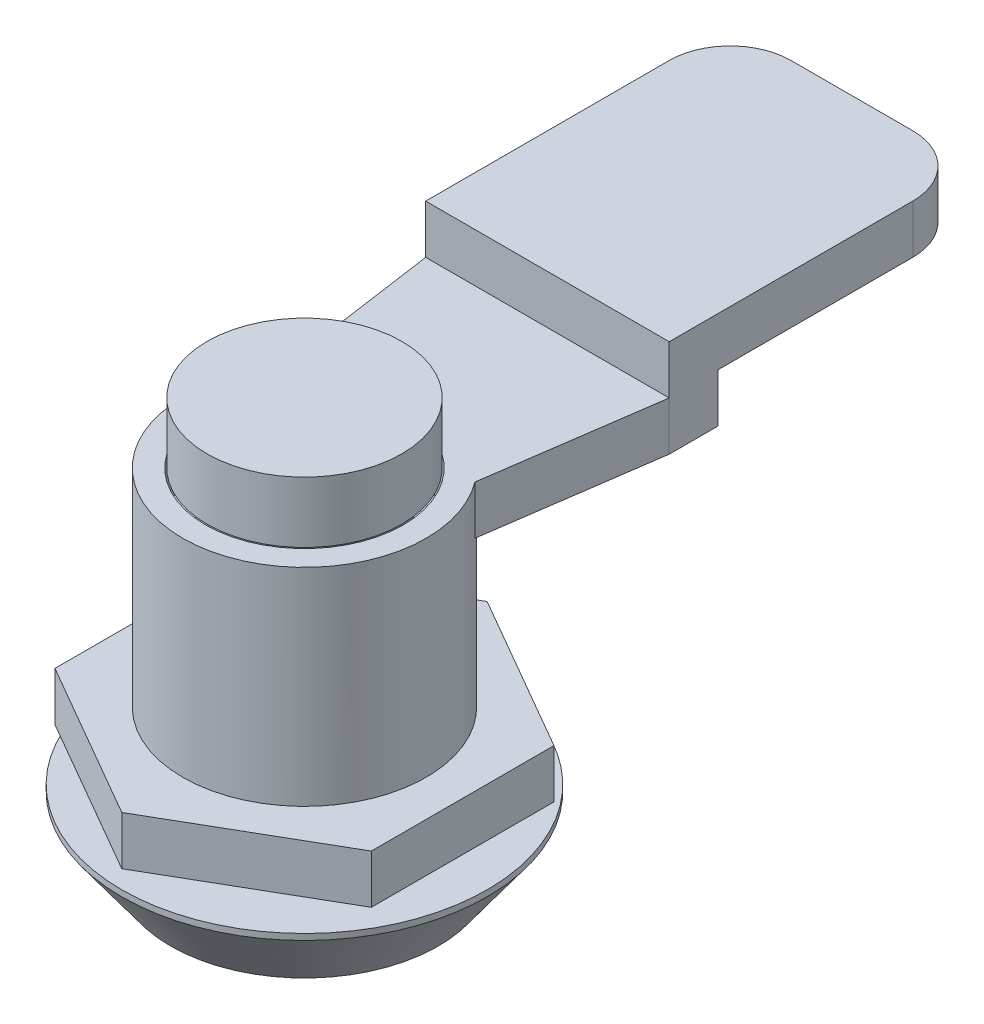
ISO-10303-21;
HEADER;
FILE_DESCRIPTION(('STEP AP214'),'2;1');
FILE_NAME('part.step','',(''),(''),'','','');
FILE_SCHEMA(('AUTOMOTIVE_DESIGN { 1 0 10303 214 1 1 1 1 }'));
ENDSEC;
DATA;
#1=APPLICATION_CONTEXT('core data for automotive mechanical design processes');
#2=APPLICATION_PROTOCOL_DEFINITION('international standard','automotive_design',2000,#1);
#3=PRODUCT_CONTEXT('',#1,'mechanical');
#4=PRODUCT('Part','Part','',(#3));
#5=PRODUCT_RELATED_PRODUCT_CATEGORY('part','',(#4));
#6=PRODUCT_DEFINITION_FORMATION('','',#4);
#7=PRODUCT_DEFINITION_CONTEXT('part definition',#1,'design');
#8=PRODUCT_DEFINITION('design','',#6,#7);
#9=PRODUCT_DEFINITION_SHAPE('','',#8);
#10=(LENGTH_UNIT() NAMED_UNIT(*) SI_UNIT(.MILLI.,.METRE.));
#11=(NAMED_UNIT(*) PLANE_ANGLE_UNIT() SI_UNIT($,.RADIAN.));
#12=(NAMED_UNIT(*) SI_UNIT($,.STERADIAN.) SOLID_ANGLE_UNIT());
#13=UNCERTAINTY_MEASURE_WITH_UNIT(LENGTH_MEASURE(1.E-05),#10,'distance_accuracy_value','');
#14=(GEOMETRIC_REPRESENTATION_CONTEXT(3) GLOBAL_UNCERTAINTY_ASSIGNED_CONTEXT((#13)) GLOBAL_UNIT_ASSIGNED_CONTEXT((#10,
#11,#12)) REPRESENTATION_CONTEXT('',''));
#15=CARTESIAN_POINT('',(0.,0.,0.));
#16=DIRECTION('',(0.,0.,1.));
#17=DIRECTION('',(1.,0.,0.));
#18=AXIS2_PLACEMENT_3D('',#15,#16,#17);
#19=CARTESIAN_POINT('',(-10.0000000000012,67.9065175404754,-23.9539927647359));
#20=DIRECTION('',(0.,0.,1.));
#21=DIRECTION('',(1.,0.,0.));
#22=AXIS2_PLACEMENT_3D('',#19,#20,#21);
#23=PLANE('',#22);
#24=DIRECTION('',(-1.,0.,0.));
#25=VECTOR('',#24,1.);
#26=CARTESIAN_POINT('',(9.99999999999879,28.5000000000001,-23.9539927647363));
#27=LINE('',#26,#25);
#28=CARTESIAN_POINT('',(9.99999999999879,28.5000000000001,-23.9539927647363));
#29=VERTEX_POINT('',#28);
#30=CARTESIAN_POINT('',(-10.0000000000012,28.5000000000001,-23.9539927647364));
#31=VERTEX_POINT('',#30);
#32=EDGE_CURVE('E192',#29,#31,#27,.T.);
#33=ORIENTED_EDGE('',*,*,#32,.F.);
#34=DIRECTION('',(0.,-1.,0.));
#35=VECTOR('',#34,1.);
#36=CARTESIAN_POINT('',(9.99999999999879,67.9065175404753,-23.9539927647359));
#37=LINE('',#36,#35);
#38=CARTESIAN_POINT('',(9.99999999999879,24.5000000000001,-23.9539927647358));
#39=VERTEX_POINT('',#38);
#40=EDGE_CURVE('E197',#29,#39,#37,.T.);
#41=ORIENTED_EDGE('',*,*,#40,.T.);
#42=DIRECTION('',(-1.,0.,0.));
#43=VECTOR('',#42,1.);
#44=CARTESIAN_POINT('',(-10.0000000000012,24.5,-23.9539927647359));
#45=LINE('',#44,#43);
#46=CARTESIAN_POINT('',(-10.0000000000012,24.5,-23.9539927647359));
#47=VERTEX_POINT('',#46);
#48=EDGE_CURVE('E195',#39,#47,#45,.T.);
#49=ORIENTED_EDGE('',*,*,#48,.T.);
#50=DIRECTION('',(0.,-1.,0.));
#51=VECTOR('',#50,1.);
#52=CARTESIAN_POINT('',(-10.0000000000012,67.9065175404754,-23.9539927647359));
#53=LINE('',#52,#51);
#54=EDGE_CURVE('E181',#31,#47,#53,.T.);
#55=ORIENTED_EDGE('',*,*,#54,.F.);
#56=EDGE_LOOP('',(#33,#41,#49,#55));
#57=FACE_BOUND('',#56,.T.);
#58=ADVANCED_FACE('F39',(#57),#23,.F.);
#59=CARTESIAN_POINT('',(-9.99200722162641E-13,5.00000000000013,4.9960036108132E-13));
#60=DIRECTION('',(0.,-1.,0.));
#61=DIRECTION('',(0.,0.,-1.));
#62=AXIS2_PLACEMENT_3D('',#59,#60,#61);
#63=PLANE('',#62);
#64=CARTESIAN_POINT('',(-9.99200722162641E-13,5.00000000000013,4.9960036108132E-13));
#65=DIRECTION('',(0.,-1.,0.));
#66=DIRECTION('',(0.,0.,-1.));
#67=AXIS2_PLACEMENT_3D('',#64,#65,#66);
#68=CIRCLE('',#67,9.25);
#69=CARTESIAN_POINT('',(-9.99200722162641E-13,5.00000000000013,-9.24999999999955));
#70=VERTEX_POINT('',#69);
#71=EDGE_CURVE('E303',#70,#70,#68,.T.);
#72=ORIENTED_EDGE('',*,*,#71,.T.);
#73=EDGE_LOOP('',(#72));
#74=FACE_BOUND('',#73,.T.);
#75=DIRECTION('',(1.,0.,0.));
#76=VECTOR('',#75,1.);
#77=CARTESIAN_POINT('',(4.49999999999895,5.00000000000013,-3.89711431702949));
#78=LINE('',#77,#76);
#79=CARTESIAN_POINT('',(-4.50000000000095,5.00000000000013,-3.89711431702938));
#80=VERTEX_POINT('',#79);
#81=CARTESIAN_POINT('',(4.49999999999895,5.00000000000013,-3.89711431702949));
#82=VERTEX_POINT('',#81);
#83=EDGE_CURVE('E230',#80,#82,#78,.T.);
#84=ORIENTED_EDGE('',*,*,#83,.F.);
#85=DIRECTION('',(-0.5,0.,-0.866025403784443));
#86=VECTOR('',#85,1.);
#87=CARTESIAN_POINT('',(-4.50000000000095,5.00000000000013,-3.89711431702938));
#88=LINE('',#87,#86);
#89=CARTESIAN_POINT('',(-9.99200722162641E-13,5.00000000000013,3.89711431703049));
#90=VERTEX_POINT('',#89);
#91=EDGE_CURVE('E244',#90,#80,#88,.T.);
#92=ORIENTED_EDGE('',*,*,#91,.F.);
#93=DIRECTION('',(-0.5,0.,0.866025403784443));
#94=VECTOR('',#93,1.);
#95=CARTESIAN_POINT('',(-9.99200722162641E-13,5.00000000000013,3.89711431703049));
#96=LINE('',#95,#94);
#97=EDGE_CURVE('E241',#82,#90,#96,.T.);
#98=ORIENTED_EDGE('',*,*,#97,.F.);
#99=EDGE_LOOP('',(#84,#92,#98));
#100=FACE_BOUND('',#99,.T.);
#101=ADVANCED_FACE('F424',(#74,#100),#63,.T.);
#102=CARTESIAN_POINT('',(14.999999999999,11.5000000000001,0.));
#103=DIRECTION('',(0.,-1.,0.));
#104=DIRECTION('',(0.,0.,-1.));
#105=AXIS2_PLACEMENT_3D('',#102,#103,#104);
#106=PLANE('',#105);
#107=CARTESIAN_POINT('',(-9.99200722162641E-13,11.5000000000001,1.11022302462516E-13));
#108=DIRECTION('',(0.,1.,0.));
#109=DIRECTION('',(0.,0.,1.));
#110=AXIS2_PLACEMENT_3D('',#107,#108,#109);
#111=CIRCLE('',#110,10.);
#112=CARTESIAN_POINT('',(-9.99200722162641E-13,11.5000000000001,10.0000000000002));
#113=VERTEX_POINT('',#112);
#114=EDGE_CURVE('E356',#113,#113,#111,.T.);
#115=ORIENTED_EDGE('',*,*,#114,.F.);
#116=EDGE_LOOP('',(#115));
#117=FACE_BOUND('',#116,.T.);
#118=DIRECTION('',(0.866025403784442,0.,0.499999999999996));
#119=VECTOR('',#118,1.);
#120=CARTESIAN_POINT('',(-12.990381056768,11.5,7.50000000000023));
#121=LINE('',#120,#119);
#122=CARTESIAN_POINT('',(-12.990381056768,11.5,7.50000000000023));
#123=VERTEX_POINT('',#122);
#124=CARTESIAN_POINT('',(-1.11022302462516E-12,11.5000000000002,15.0000000000001));
#125=VERTEX_POINT('',#124);
#126=EDGE_CURVE('E238',#123,#125,#121,.T.);
#127=ORIENTED_EDGE('',*,*,#126,.T.);
#128=DIRECTION('',(0.866025403784435,0.,-0.500000000000008));
#129=VECTOR('',#128,1.);
#130=CARTESIAN_POINT('',(-1.11022302462516E-12,11.5000000000002,15.0000000000001));
#131=LINE('',#130,#129);
#132=CARTESIAN_POINT('',(12.9903810567652,11.5,7.4999999999999));
#133=VERTEX_POINT('',#132);
#134=EDGE_CURVE('E276',#125,#133,#131,.T.);
#135=ORIENTED_EDGE('',*,*,#134,.T.);
#136=DIRECTION('',(0.,0.,-1.));
#137=VECTOR('',#136,1.);
#138=CARTESIAN_POINT('',(12.9903810567652,11.5,7.4999999999999));
#139=LINE('',#138,#137);
#140=CARTESIAN_POINT('',(12.9903810567655,11.5000000000001,-7.50000000000012));
#141=VERTEX_POINT('',#140);
#142=EDGE_CURVE('E279',#133,#141,#139,.T.);
#143=ORIENTED_EDGE('',*,*,#142,.T.);
#144=DIRECTION('',(-0.866025403784443,0.,-0.499999999999996));
#145=VECTOR('',#144,1.);
#146=CARTESIAN_POINT('',(12.9903810567655,11.5000000000001,-7.50000000000012));
#147=LINE('',#146,#145);
#148=CARTESIAN_POINT('',(-1.11022302462516E-12,11.5000000000001,-14.9999999999999));
#149=VERTEX_POINT('',#148);
#150=EDGE_CURVE('E282',#141,#149,#147,.T.);
#151=ORIENTED_EDGE('',*,*,#150,.T.);
#152=DIRECTION('',(-0.866025403784435,0.,0.500000000000009));
#153=VECTOR('',#152,1.);
#154=CARTESIAN_POINT('',(-1.11022302462516E-12,11.5000000000001,-14.9999999999999));
#155=LINE('',#154,#153);
#156=CARTESIAN_POINT('',(-12.9903810567676,11.5000000000002,-7.49999999999979));
#157=VERTEX_POINT('',#156);
#158=EDGE_CURVE('E285',#149,#157,#155,.T.);
#159=ORIENTED_EDGE('',*,*,#158,.T.);
#160=DIRECTION('',(0.,0.,1.));
#161=VECTOR('',#160,1.);
#162=CARTESIAN_POINT('',(-12.9903810567676,11.5000000000002,-7.49999999999979));
#163=LINE('',#162,#161);
#164=EDGE_CURVE('E258',#157,#123,#163,.T.);
#165=ORIENTED_EDGE('',*,*,#164,.T.);
#166=EDGE_LOOP('',(#127,#135,#143,#151,#159,#165));
#167=FACE_BOUND('',#166,.T.);
#168=ADVANCED_FACE('F429',(#117,#167),#106,.F.);
#169=CARTESIAN_POINT('',(-9.99200722162641E-13,38.1343243243245,4.9960036108132E-13));
#170=DIRECTION('',(0.,1.,0.));
#171=DIRECTION('',(0.,0.,1.));
#172=AXIS2_PLACEMENT_3D('',#169,#170,#171);
#173=CYLINDRICAL_SURFACE('',#172,10.);
#174=CARTESIAN_POINT('',(-9.99200722162641E-13,24.5000000000001,6.10622663543836E-13));
#175=DIRECTION('',(0.,1.,0.));
#176=DIRECTION('',(0.,0.,1.));
#177=AXIS2_PLACEMENT_3D('',#174,#175,#176);
#178=CIRCLE('',#177,10.);
#179=CARTESIAN_POINT('',(7.99999999999901,24.5000000000003,-5.99999999999962));
#180=VERTEX_POINT('',#179);
#181=CARTESIAN_POINT('',(-8.00000000000101,24.5000000000003,-5.99999999999962));
#182=VERTEX_POINT('',#181);
#183=EDGE_CURVE('E359',#180,#182,#178,.T.);
#184=ORIENTED_EDGE('',*,*,#183,.F.);
#185=DIRECTION('',(0.,-1.,0.));
#186=VECTOR('',#185,1.);
#187=CARTESIAN_POINT('',(7.99999999999901,67.9065175404756,-5.99999999999962));
#188=LINE('',#187,#186);
#189=CARTESIAN_POINT('',(7.99999999999901,28.5000000000003,-6.00000000000012));
#190=VERTEX_POINT('',#189);
#191=EDGE_CURVE('E373',#190,#180,#188,.T.);
#192=ORIENTED_EDGE('',*,*,#191,.F.);
#193=CARTESIAN_POINT('',(-9.99200722162641E-13,28.5000000000002,1.11022302462516E-13));
#194=DIRECTION('',(0.,1.,0.));
#195=DIRECTION('',(0.,0.,1.));
#196=AXIS2_PLACEMENT_3D('',#193,#194,#195);
#197=CIRCLE('',#196,10.);
#198=CARTESIAN_POINT('',(-8.00000000000101,28.5000000000003,-6.00000000000012));
#199=VERTEX_POINT('',#198);
#200=EDGE_CURVE('E314',#199,#190,#197,.T.);
#201=ORIENTED_EDGE('',*,*,#200,.F.);
#202=DIRECTION('',(0.,-1.,0.));
#203=VECTOR('',#202,1.);
#204=CARTESIAN_POINT('',(-8.00000000000101,67.9065175404754,-5.99999999999962));
#205=LINE('',#204,#203);
#206=EDGE_CURVE('E332',#199,#182,#205,.T.);
#207=ORIENTED_EDGE('',*,*,#206,.T.);
#208=EDGE_LOOP('',(#184,#192,#201,#207));
#209=FACE_BOUND('',#208,.T.);
#210=ORIENTED_EDGE('',*,*,#114,.T.);
#211=EDGE_LOOP('',(#210));
#212=FACE_BOUND('',#211,.T.);
#213=ADVANCED_FACE('F464',(#209,#212),#173,.T.);
#214=CARTESIAN_POINT('',(-9.99200722162641E-13,24.5000000000001,6.10622663543836E-13));
#215=DIRECTION('',(0.,1.,0.));
#216=DIRECTION('',(0.,0.,1.));
#217=AXIS2_PLACEMENT_3D('',#214,#215,#216);
#218=PLANE('',#217);
#219=DIRECTION('',(0.141878261030738,0.,-0.989884113948145));
#220=VECTOR('',#219,1.);
#221=CARTESIAN_POINT('',(9.99999999999856,24.5,-19.9539927647358));
#222=LINE('',#221,#220);
#223=CARTESIAN_POINT('',(9.99999999999856,24.5,-19.9539927647358));
#224=VERTEX_POINT('',#223);
#225=EDGE_CURVE('E320',#180,#224,#222,.T.);
#226=ORIENTED_EDGE('',*,*,#225,.F.);
#227=ORIENTED_EDGE('',*,*,#183,.T.);
#228=DIRECTION('',(0.141878261030738,0.,0.989884113948145));
#229=VECTOR('',#228,1.);
#230=CARTESIAN_POINT('',(-8.00000000000101,24.5000000000003,-5.99999999999962));
#231=LINE('',#230,#229);
#232=CARTESIAN_POINT('',(-10.0000000000015,24.5,-19.9539927647359));
#233=VERTEX_POINT('',#232);
#234=EDGE_CURVE('E329',#233,#182,#231,.T.);
#235=ORIENTED_EDGE('',*,*,#234,.F.);
#236=DIRECTION('',(0.,0.,1.));
#237=VECTOR('',#236,1.);
#238=CARTESIAN_POINT('',(-10.0000000000015,24.5,-19.9539927647359));
#239=LINE('',#238,#237);
#240=EDGE_CURVE('E327',#47,#233,#239,.T.);
#241=ORIENTED_EDGE('',*,*,#240,.F.);
#242=ORIENTED_EDGE('',*,*,#48,.F.);
#243=DIRECTION('',(0.,0.,-1.));
#244=VECTOR('',#243,1.);
#245=CARTESIAN_POINT('',(9.99999999999879,24.5000000000001,-23.9539927647358));
#246=LINE('',#245,#244);
#247=EDGE_CURVE('E323',#224,#39,#246,.T.);
#248=ORIENTED_EDGE('',*,*,#247,.F.);
#249=EDGE_LOOP('',(#226,#227,#235,#241,#242,#248));
#250=FACE_BOUND('',#249,.T.);
#251=ADVANCED_FACE('F384',(#250),#218,.F.);
#252=CARTESIAN_POINT('',(-8.00000000000101,67.9065175404754,-5.99999999999962));
#253=DIRECTION('',(0.98988411394814,0.,-0.141878261030739));
#254=DIRECTION('',(-0.141878261030738,0.,-0.989884113948145));
#255=AXIS2_PLACEMENT_3D('',#252,#253,#254);
#256=PLANE('',#255);
#257=DIRECTION('',(0.141878261030738,0.,0.989884113948145));
#258=VECTOR('',#257,1.);
#259=CARTESIAN_POINT('',(-8.00000000000101,28.5000000000003,-6.00000000000012));
#260=LINE('',#259,#258);
#261=CARTESIAN_POINT('',(-10.0000000000015,28.5,-19.9539927647364));
#262=VERTEX_POINT('',#261);
#263=EDGE_CURVE('E309',#262,#199,#260,.T.);
#264=ORIENTED_EDGE('',*,*,#263,.F.);
#265=DIRECTION('',(0.,-1.,0.));
#266=VECTOR('',#265,1.);
#267=CARTESIAN_POINT('',(-10.0000000000015,67.9065175404754,-19.9539927647359));
#268=LINE('',#267,#266);
#269=EDGE_CURVE('E198',#262,#233,#268,.T.);
#270=ORIENTED_EDGE('',*,*,#269,.T.);
#271=ORIENTED_EDGE('',*,*,#234,.T.);
#272=ORIENTED_EDGE('',*,*,#206,.F.);
#273=EDGE_LOOP('',(#264,#270,#271,#272));
#274=FACE_BOUND('',#273,.T.);
#275=ADVANCED_FACE('F390',(#274),#256,.F.);
#276=CARTESIAN_POINT('',(-10.0000000000015,67.9065175404754,-19.9539927647359));
#277=DIRECTION('',(1.,0.,0.));
#278=DIRECTION('',(0.,0.,-1.));
#279=AXIS2_PLACEMENT_3D('',#276,#277,#278);
#280=PLANE('',#279);
#281=DIRECTION('',(0.,0.,-1.));
#282=VECTOR('',#281,1.);
#283=CARTESIAN_POINT('',(-10.0000000000015,32.5,-19.9539927647358));
#284=LINE('',#283,#282);
#285=CARTESIAN_POINT('',(-10.0000000000015,32.5,-19.9539927647358));
#286=VERTEX_POINT('',#285);
#287=CARTESIAN_POINT('',(-10.000000000001,32.5000000000002,-39.9539927647358));
#288=VERTEX_POINT('',#287);
#289=EDGE_CURVE('E226',#286,#288,#284,.T.);
#290=ORIENTED_EDGE('',*,*,#289,.T.);
#291=DIRECTION('',(0.,1.,0.));
#292=VECTOR('',#291,1.);
#293=CARTESIAN_POINT('',(-10.000000000001,67.9065175404753,-39.9539927647359));
#294=LINE('',#293,#292);
#295=CARTESIAN_POINT('',(-10.000000000001,28.5000000000002,-39.9539927647364));
#296=VERTEX_POINT('',#295);
#297=EDGE_CURVE('E12',#288,#296,#294,.F.);
#298=ORIENTED_EDGE('',*,*,#297,.T.);
#299=DIRECTION('',(0.,0.,1.));
#300=VECTOR('',#299,1.);
#301=CARTESIAN_POINT('',(-10.000000000001,28.5000000000001,-44.9539927647363));
#302=LINE('',#301,#300);
#303=EDGE_CURVE('E177',#296,#31,#302,.T.);
#304=ORIENTED_EDGE('',*,*,#303,.T.);
#305=ORIENTED_EDGE('',*,*,#54,.T.);
#306=ORIENTED_EDGE('',*,*,#240,.T.);
#307=ORIENTED_EDGE('',*,*,#269,.F.);
#308=DIRECTION('',(0.,-1.,0.));
#309=VECTOR('',#308,1.);
#310=CARTESIAN_POINT('',(-10.0000000000015,32.5,-19.9539927647358));
#311=LINE('',#310,#309);
#312=EDGE_CURVE('E220',#286,#262,#311,.T.);
#313=ORIENTED_EDGE('',*,*,#312,.F.);
#314=EDGE_LOOP('',(#290,#298,#304,#305,#306,#307,#313));
#315=FACE_BOUND('',#314,.T.);
#316=ADVANCED_FACE('F179',(#315),#280,.F.);
#317=CARTESIAN_POINT('',(9.99999999999879,67.9065175404753,-23.9539927647359));
#318=DIRECTION('',(-1.,0.,0.));
#319=DIRECTION('',(0.,0.,1.));
#320=AXIS2_PLACEMENT_3D('',#317,#318,#319);
#321=PLANE('',#320);
#322=DIRECTION('',(0.,0.,1.));
#323=VECTOR('',#322,1.);
#324=CARTESIAN_POINT('',(9.99999999999901,28.5000000000002,-44.9539927647363));
#325=LINE('',#324,#323);
#326=CARTESIAN_POINT('',(9.99999999999901,28.5000000000002,-39.9539927647363));
#327=VERTEX_POINT('',#326);
#328=EDGE_CURVE('E187',#327,#29,#325,.T.);
#329=ORIENTED_EDGE('',*,*,#328,.F.);
#330=DIRECTION('',(0.,-1.,0.));
#331=VECTOR('',#330,1.);
#332=CARTESIAN_POINT('',(9.99999999999901,67.9065175404753,-39.9539927647358));
#333=LINE('',#332,#331);
#334=CARTESIAN_POINT('',(9.99999999999901,32.5000000000002,-39.9539927647359));
#335=VERTEX_POINT('',#334);
#336=EDGE_CURVE('E62',#327,#335,#333,.F.);
#337=ORIENTED_EDGE('',*,*,#336,.T.);
#338=DIRECTION('',(0.,0.,-1.));
#339=VECTOR('',#338,1.);
#340=CARTESIAN_POINT('',(9.99999999999856,32.5,-19.9539927647359));
#341=LINE('',#340,#339);
#342=CARTESIAN_POINT('',(9.99999999999856,32.5,-19.9539927647359));
#343=VERTEX_POINT('',#342);
#344=EDGE_CURVE('E228',#343,#335,#341,.T.);
#345=ORIENTED_EDGE('',*,*,#344,.F.);
#346=DIRECTION('',(0.,1.,0.));
#347=VECTOR('',#346,1.);
#348=CARTESIAN_POINT('',(9.99999999999856,32.5,-19.9539927647359));
#349=LINE('',#348,#347);
#350=CARTESIAN_POINT('',(9.99999999999856,28.5000000000001,-19.9539927647363));
#351=VERTEX_POINT('',#350);
#352=EDGE_CURVE('E215',#351,#343,#349,.T.);
#353=ORIENTED_EDGE('',*,*,#352,.F.);
#354=DIRECTION('',(0.,-1.,0.));
#355=VECTOR('',#354,1.);
#356=CARTESIAN_POINT('',(9.99999999999856,67.9065175404753,-19.9539927647359));
#357=LINE('',#356,#355);
#358=EDGE_CURVE('E377',#351,#224,#357,.T.);
#359=ORIENTED_EDGE('',*,*,#358,.T.);
#360=ORIENTED_EDGE('',*,*,#247,.T.);
#361=ORIENTED_EDGE('',*,*,#40,.F.);
#362=EDGE_LOOP('',(#329,#337,#345,#353,#359,#360,#361));
#363=FACE_BOUND('',#362,.T.);
#364=ADVANCED_FACE('F381',(#363),#321,.F.);
#365=CARTESIAN_POINT('',(9.99999999999856,67.9065175404753,-19.9539927647359));
#366=DIRECTION('',(-0.98988411394814,0.,-0.141878261030738));
#367=DIRECTION('',(-0.141878261030738,0.,0.989884113948145));
#368=AXIS2_PLACEMENT_3D('',#365,#366,#367);
#369=PLANE('',#368);
#370=DIRECTION('',(0.141878261030738,0.,-0.989884113948145));
#371=VECTOR('',#370,1.);
#372=CARTESIAN_POINT('',(9.99999999999856,28.5000000000001,-19.9539927647363));
#373=LINE('',#372,#371);
#374=EDGE_CURVE('E312',#190,#351,#373,.T.);
#375=ORIENTED_EDGE('',*,*,#374,.F.);
#376=ORIENTED_EDGE('',*,*,#191,.T.);
#377=ORIENTED_EDGE('',*,*,#225,.T.);
#378=ORIENTED_EDGE('',*,*,#358,.F.);
#379=EDGE_LOOP('',(#375,#376,#377,#378));
#380=FACE_BOUND('',#379,.T.);
#381=ADVANCED_FACE('F437',(#380),#369,.F.);
#382=CARTESIAN_POINT('',(-9.99200722162641E-13,67.9065175404753,3.88578058618805E-13));
#383=DIRECTION('',(0.,-1.,0.));
#384=DIRECTION('',(0.,0.,-1.));
#385=AXIS2_PLACEMENT_3D('',#382,#383,#384);
#386=CYLINDRICAL_SURFACE('',#385,8.11446740858499);
#387=CARTESIAN_POINT('',(-9.99200722162641E-13,24.5000000000001,6.10622663543836E-13));
#388=DIRECTION('',(0.,1.,0.));
#389=DIRECTION('',(0.,0.,1.));
#390=AXIS2_PLACEMENT_3D('',#387,#388,#389);
#391=CIRCLE('',#390,8.11446740858499);
#392=CARTESIAN_POINT('',(-9.99200722162641E-13,24.5000000000001,8.11446740858564));
#393=VERTEX_POINT('',#392);
#394=EDGE_CURVE('E317',#393,#393,#391,.T.);
#395=ORIENTED_EDGE('',*,*,#394,.F.);
#396=EDGE_LOOP('',(#395));
#397=FACE_BOUND('',#396,.T.);
#398=CARTESIAN_POINT('',(-9.99200722162641E-13,28.5000000000002,1.11022302462516E-13));
#399=DIRECTION('',(0.,1.,0.));
#400=DIRECTION('',(0.,0.,1.));
#401=AXIS2_PLACEMENT_3D('',#398,#399,#400);
#402=CIRCLE('',#401,8.11446740858499);
#403=CARTESIAN_POINT('',(-9.99200722162641E-13,28.5000000000002,8.11446740858514));
#404=VERTEX_POINT('',#403);
#405=EDGE_CURVE('E306',#404,#404,#402,.T.);
#406=ORIENTED_EDGE('',*,*,#405,.T.);
#407=EDGE_LOOP('',(#406));
#408=FACE_BOUND('',#407,.T.);
#409=ADVANCED_FACE('F440',(#397,#408),#386,.F.);
#410=CARTESIAN_POINT('',(6.32626472050979,28.5000000000001,-1.11022302462516E-13));
#411=DIRECTION('',(0.,1.,0.));
#412=DIRECTION('',(0.,0.,1.));
#413=AXIS2_PLACEMENT_3D('',#410,#411,#412);
#414=PLANE('',#413);
#415=DIRECTION('',(1.,0.,0.));
#416=VECTOR('',#415,1.);
#417=CARTESIAN_POINT('',(9.99999999999856,28.5000000000001,-19.9539927647363));
#418=LINE('',#417,#416);
#419=EDGE_CURVE('E223',#262,#351,#418,.T.);
#420=ORIENTED_EDGE('',*,*,#419,.F.);
#421=ORIENTED_EDGE('',*,*,#263,.T.);
#422=ORIENTED_EDGE('',*,*,#200,.T.);
#423=ORIENTED_EDGE('',*,*,#374,.T.);
#424=EDGE_LOOP('',(#420,#421,#422,#423));
#425=FACE_BOUND('',#424,.T.);
#426=ORIENTED_EDGE('',*,*,#405,.F.);
#427=EDGE_LOOP('',(#426));
#428=FACE_BOUND('',#427,.T.);
#429=ADVANCED_FACE('F446',(#425,#428),#414,.T.);
#430=CARTESIAN_POINT('',(7.99999999999901,33.5000000000002,4.9960036108132E-13));
#431=DIRECTION('',(0.,-1.,0.));
#432=DIRECTION('',(0.,0.,-1.));
#433=AXIS2_PLACEMENT_3D('',#430,#431,#432);
#434=PLANE('',#433);
#435=CARTESIAN_POINT('',(-9.99200722162641E-13,33.5000000000002,4.9960036108132E-13));
#436=DIRECTION('',(0.,1.,0.));
#437=DIRECTION('',(0.,0.,1.));
#438=AXIS2_PLACEMENT_3D('',#435,#436,#437);
#439=CIRCLE('',#438,8.);
#440=CARTESIAN_POINT('',(-9.99200722162641E-13,33.5000000000002,8.00000000000054));
#441=VERTEX_POINT('',#440);
#442=EDGE_CURVE('E370',#441,#441,#439,.T.);
#443=ORIENTED_EDGE('',*,*,#442,.T.);
#444=EDGE_LOOP('',(#443));
#445=FACE_BOUND('',#444,.T.);
#446=ADVANCED_FACE('F442',(#445),#434,.F.);
#447=CARTESIAN_POINT('',(-9.99200722162641E-13,38.1343243243245,4.9960036108132E-13));
#448=DIRECTION('',(0.,1.,0.));
#449=DIRECTION('',(0.,0.,1.));
#450=AXIS2_PLACEMENT_3D('',#447,#448,#449);
#451=CYLINDRICAL_SURFACE('',#450,8.);
#452=ORIENTED_EDGE('',*,*,#442,.F.);
#453=EDGE_LOOP('',(#452));
#454=FACE_BOUND('',#453,.T.);
#455=CARTESIAN_POINT('',(-9.99200722162641E-13,28.5000000000002,1.11022302462516E-13));
#456=DIRECTION('',(0.,1.,0.));
#457=DIRECTION('',(0.,0.,1.));
#458=AXIS2_PLACEMENT_3D('',#455,#456,#457);
#459=CIRCLE('',#458,8.);
#460=CARTESIAN_POINT('',(-9.99200722162641E-13,28.5000000000002,8.00000000000015));
#461=VERTEX_POINT('',#460);
#462=EDGE_CURVE('E367',#461,#461,#459,.T.);
#463=ORIENTED_EDGE('',*,*,#462,.T.);
#464=EDGE_LOOP('',(#463));
#465=FACE_BOUND('',#464,.T.);
#466=ADVANCED_FACE('F445',(#454,#465),#451,.T.);
#467=CARTESIAN_POINT('',(6.32626472050979,28.5000000000001,-1.11022302462516E-13));
#468=DIRECTION('',(0.,1.,0.));
#469=DIRECTION('',(0.,0.,1.));
#470=AXIS2_PLACEMENT_3D('',#467,#468,#469);
#471=PLANE('',#470);
#472=ORIENTED_EDGE('',*,*,#462,.F.);
#473=EDGE_LOOP('',(#472));
#474=FACE_BOUND('',#473,.T.);
#475=CARTESIAN_POINT('',(-9.99200722162641E-13,28.5000000000002,1.11022302462516E-13));
#476=DIRECTION('',(0.,1.,0.));
#477=DIRECTION('',(0.,0.,1.));
#478=AXIS2_PLACEMENT_3D('',#475,#476,#477);
#479=CIRCLE('',#478,6.3262647205108);
#480=CARTESIAN_POINT('',(-9.99200722162641E-13,28.5000000000002,6.32626472051094));
#481=VERTEX_POINT('',#480);
#482=EDGE_CURVE('E364',#481,#481,#479,.T.);
#483=ORIENTED_EDGE('',*,*,#482,.T.);
#484=EDGE_LOOP('',(#483));
#485=FACE_BOUND('',#484,.T.);
#486=ADVANCED_FACE('F450',(#474,#485),#471,.F.);
#487=CARTESIAN_POINT('',(-9.99200722162641E-13,38.1343243243245,4.9960036108132E-13));
#488=DIRECTION('',(0.,1.,0.));
#489=DIRECTION('',(0.,0.,1.));
#490=AXIS2_PLACEMENT_3D('',#487,#488,#489);
#491=CYLINDRICAL_SURFACE('',#490,6.3262647205108);
#492=ORIENTED_EDGE('',*,*,#482,.F.);
#493=EDGE_LOOP('',(#492));
#494=FACE_BOUND('',#493,.T.);
#495=CARTESIAN_POINT('',(-9.99200722162641E-13,24.5000000000001,6.10622663543836E-13));
#496=DIRECTION('',(0.,1.,0.));
#497=DIRECTION('',(0.,0.,1.));
#498=AXIS2_PLACEMENT_3D('',#495,#496,#497);
#499=CIRCLE('',#498,6.3262647205108);
#500=CARTESIAN_POINT('',(-9.99200722162641E-13,24.5000000000001,6.32626472051144));
#501=VERTEX_POINT('',#500);
#502=EDGE_CURVE('E361',#501,#501,#499,.T.);
#503=ORIENTED_EDGE('',*,*,#502,.T.);
#504=EDGE_LOOP('',(#503));
#505=FACE_BOUND('',#504,.T.);
#506=ADVANCED_FACE('F454',(#494,#505),#491,.T.);
#507=CARTESIAN_POINT('',(9.99999999999901,24.5,4.9960036108132E-13));
#508=DIRECTION('',(0.,-1.,0.));
#509=DIRECTION('',(0.,0.,-1.));
#510=AXIS2_PLACEMENT_3D('',#507,#508,#509);
#511=PLANE('',#510);
#512=ORIENTED_EDGE('',*,*,#394,.T.);
#513=EDGE_LOOP('',(#512));
#514=FACE_BOUND('',#513,.T.);
#515=ORIENTED_EDGE('',*,*,#502,.F.);
#516=EDGE_LOOP('',(#515));
#517=FACE_BOUND('',#516,.T.);
#518=ADVANCED_FACE('F458',(#514,#517),#511,.F.);
#519=CARTESIAN_POINT('',(-12.990381056768,7.49999999999999,7.50000000000051));
#520=DIRECTION('',(-0.499999999999994,0.,0.866025403784447));
#521=DIRECTION('',(0.866025403784442,0.,0.499999999999996));
#522=AXIS2_PLACEMENT_3D('',#519,#520,#521);
#523=PLANE('',#522);
#524=ORIENTED_EDGE('',*,*,#126,.F.);
#525=DIRECTION('',(0.,1.,0.));
#526=VECTOR('',#525,1.);
#527=CARTESIAN_POINT('',(-12.990381056768,7.49999999999999,7.50000000000051));
#528=LINE('',#527,#526);
#529=CARTESIAN_POINT('',(-12.990381056768,7.49999999999999,7.50000000000051));
#530=VERTEX_POINT('',#529);
#531=EDGE_CURVE('E290',#530,#123,#528,.T.);
#532=ORIENTED_EDGE('',*,*,#531,.F.);
#533=DIRECTION('',(0.866025403784442,0.,0.499999999999996));
#534=VECTOR('',#533,1.);
#535=CARTESIAN_POINT('',(-12.990381056768,7.49999999999999,7.50000000000051));
#536=LINE('',#535,#534);
#537=CARTESIAN_POINT('',(-1.22124532708767E-12,7.50000000000024,15.0000000000006));
#538=VERTEX_POINT('',#537);
#539=EDGE_CURVE('E255',#530,#538,#536,.T.);
#540=ORIENTED_EDGE('',*,*,#539,.T.);
#541=DIRECTION('',(0.,1.,0.));
#542=VECTOR('',#541,1.);
#543=CARTESIAN_POINT('',(-1.11022302462516E-12,7.50000000000024,15.0000000000006));
#544=LINE('',#543,#542);
#545=EDGE_CURVE('E273',#538,#125,#544,.T.);
#546=ORIENTED_EDGE('',*,*,#545,.T.);
#547=EDGE_LOOP('',(#524,#532,#540,#546));
#548=FACE_BOUND('',#547,.T.);
#549=ADVANCED_FACE('F462',(#548),#523,.T.);
#550=CARTESIAN_POINT('',(-12.9903810567676,7.50000000000013,-7.49999999999951));
#551=DIRECTION('',(-1.,0.,0.));
#552=DIRECTION('',(0.,0.,1.));
#553=AXIS2_PLACEMENT_3D('',#550,#551,#552);
#554=PLANE('',#553);
#555=ORIENTED_EDGE('',*,*,#164,.F.);
#556=DIRECTION('',(0.,1.,0.));
#557=VECTOR('',#556,1.);
#558=CARTESIAN_POINT('',(-12.9903810567676,7.50000000000013,-7.49999999999951));
#559=LINE('',#558,#557);
#560=CARTESIAN_POINT('',(-12.9903810567676,7.50000000000013,-7.49999999999951));
#561=VERTEX_POINT('',#560);
#562=EDGE_CURVE('E293',#561,#157,#559,.T.);
#563=ORIENTED_EDGE('',*,*,#562,.F.);
#564=DIRECTION('',(0.,0.,1.));
#565=VECTOR('',#564,1.);
#566=CARTESIAN_POINT('',(-12.9903810567676,7.50000000000013,-7.49999999999951));
#567=LINE('',#566,#565);
#568=EDGE_CURVE('E270',#561,#530,#567,.T.);
#569=ORIENTED_EDGE('',*,*,#568,.T.);
#570=ORIENTED_EDGE('',*,*,#531,.T.);
#571=EDGE_LOOP('',(#555,#563,#569,#570));
#572=FACE_BOUND('',#571,.T.);
#573=ADVANCED_FACE('F569',(#572),#554,.T.);
#574=CARTESIAN_POINT('',(-1.11022302462516E-12,7.50000000000016,-14.9999999999995));
#575=DIRECTION('',(-0.500000000000007,0.,-0.86602540378444));
#576=DIRECTION('',(-0.866025403784435,0.,0.500000000000009));
#577=AXIS2_PLACEMENT_3D('',#574,#575,#576);
#578=PLANE('',#577);
#579=ORIENTED_EDGE('',*,*,#158,.F.);
#580=DIRECTION('',(0.,1.,0.));
#581=VECTOR('',#580,1.);
#582=CARTESIAN_POINT('',(-1.11022302462516E-12,7.50000000000016,-14.9999999999995));
#583=LINE('',#582,#581);
#584=CARTESIAN_POINT('',(-1.11022302462516E-12,7.50000000000016,-14.9999999999995));
#585=VERTEX_POINT('',#584);
#586=EDGE_CURVE('E295',#585,#149,#583,.T.);
#587=ORIENTED_EDGE('',*,*,#586,.F.);
#588=DIRECTION('',(-0.866025403784435,0.,0.500000000000009));
#589=VECTOR('',#588,1.);
#590=CARTESIAN_POINT('',(-1.11022302462516E-12,7.50000000000016,-14.9999999999995));
#591=LINE('',#590,#589);
#592=EDGE_CURVE('E267',#585,#561,#591,.T.);
#593=ORIENTED_EDGE('',*,*,#592,.T.);
#594=ORIENTED_EDGE('',*,*,#562,.T.);
#595=EDGE_LOOP('',(#579,#587,#593,#594));
#596=FACE_BOUND('',#595,.T.);
#597=ADVANCED_FACE('F576',(#596),#578,.T.);
#598=CARTESIAN_POINT('',(12.9903810567655,7.50000000000016,-7.49999999999962));
#599=DIRECTION('',(0.499999999999993,0.,-0.866025403784447));
#600=DIRECTION('',(-0.866025403784443,0.,-0.499999999999996));
#601=AXIS2_PLACEMENT_3D('',#598,#599,#600);
#602=PLANE('',#601);
#603=ORIENTED_EDGE('',*,*,#150,.F.);
#604=DIRECTION('',(0.,1.,0.));
#605=VECTOR('',#604,1.);
#606=CARTESIAN_POINT('',(12.9903810567655,7.50000000000016,-7.49999999999962));
#607=LINE('',#606,#605);
#608=CARTESIAN_POINT('',(12.9903810567655,7.50000000000016,-7.49999999999962));
#609=VERTEX_POINT('',#608);
#610=EDGE_CURVE('E297',#609,#141,#607,.T.);
#611=ORIENTED_EDGE('',*,*,#610,.F.);
#612=DIRECTION('',(-0.866025403784443,0.,-0.499999999999996));
#613=VECTOR('',#612,1.);
#614=CARTESIAN_POINT('',(12.9903810567655,7.50000000000016,-7.49999999999962));
#615=LINE('',#614,#613);
#616=EDGE_CURVE('E264',#609,#585,#615,.T.);
#617=ORIENTED_EDGE('',*,*,#616,.T.);
#618=ORIENTED_EDGE('',*,*,#586,.T.);
#619=EDGE_LOOP('',(#603,#611,#617,#618));
#620=FACE_BOUND('',#619,.T.);
#621=ADVANCED_FACE('F584',(#620),#602,.T.);
#622=CARTESIAN_POINT('',(12.9903810567652,7.50000000000012,7.5000000000004));
#623=DIRECTION('',(1.,0.,0.));
#624=DIRECTION('',(0.,0.,-1.));
#625=AXIS2_PLACEMENT_3D('',#622,#623,#624);
#626=PLANE('',#625);
#627=ORIENTED_EDGE('',*,*,#142,.F.);
#628=DIRECTION('',(0.,1.,0.));
#629=VECTOR('',#628,1.);
#630=CARTESIAN_POINT('',(12.9903810567652,7.50000000000012,7.5000000000004));
#631=LINE('',#630,#629);
#632=CARTESIAN_POINT('',(12.9903810567652,7.50000000000012,7.5000000000004));
#633=VERTEX_POINT('',#632);
#634=EDGE_CURVE('E299',#633,#133,#631,.T.);
#635=ORIENTED_EDGE('',*,*,#634,.F.);
#636=DIRECTION('',(0.,0.,-1.));
#637=VECTOR('',#636,1.);
#638=CARTESIAN_POINT('',(12.9903810567652,7.50000000000012,7.5000000000004));
#639=LINE('',#638,#637);
#640=EDGE_CURVE('E261',#633,#609,#639,.T.);
#641=ORIENTED_EDGE('',*,*,#640,.T.);
#642=ORIENTED_EDGE('',*,*,#610,.T.);
#643=EDGE_LOOP('',(#627,#635,#641,#642));
#644=FACE_BOUND('',#643,.T.);
#645=ADVANCED_FACE('F509',(#644),#626,.T.);
#646=CARTESIAN_POINT('',(-1.11022302462516E-12,7.50000000000024,15.0000000000006));
#647=DIRECTION('',(0.500000000000006,0.,0.86602540378444));
#648=DIRECTION('',(0.866025403784435,0.,-0.500000000000008));
#649=AXIS2_PLACEMENT_3D('',#646,#647,#648);
#650=PLANE('',#649);
#651=ORIENTED_EDGE('',*,*,#134,.F.);
#652=ORIENTED_EDGE('',*,*,#545,.F.);
#653=DIRECTION('',(0.866025403784435,0.,-0.500000000000008));
#654=VECTOR('',#653,1.);
#655=CARTESIAN_POINT('',(-1.11022302462516E-12,7.50000000000024,15.0000000000006));
#656=LINE('',#655,#654);
#657=EDGE_CURVE('E257',#538,#633,#656,.T.);
#658=ORIENTED_EDGE('',*,*,#657,.T.);
#659=ORIENTED_EDGE('',*,*,#634,.T.);
#660=EDGE_LOOP('',(#651,#652,#658,#659));
#661=FACE_BOUND('',#660,.T.);
#662=ADVANCED_FACE('F498',(#661),#650,.T.);
#663=CARTESIAN_POINT('',(-9.99200722162641E-13,5.00000000000013,4.9960036108132E-13));
#664=DIRECTION('',(0.,-1.,0.));
#665=DIRECTION('',(0.,0.,-1.));
#666=AXIS2_PLACEMENT_3D('',#663,#664,#665);
#667=CYLINDRICAL_SURFACE('',#666,9.25);
#668=ORIENTED_EDGE('',*,*,#71,.F.);
#669=EDGE_LOOP('',(#668));
#670=FACE_BOUND('',#669,.T.);
#671=CARTESIAN_POINT('',(-9.99200722162641E-13,0.,4.9960036108132E-13));
#672=DIRECTION('',(0.,-1.,0.));
#673=DIRECTION('',(0.,0.,-1.));
#674=AXIS2_PLACEMENT_3D('',#671,#672,#673);
#675=CIRCLE('',#674,9.25);
#676=CARTESIAN_POINT('',(-9.99200722162641E-13,0.,-9.24999999999955));
#677=VERTEX_POINT('',#676);
#678=EDGE_CURVE('E292',#677,#677,#675,.T.);
#679=ORIENTED_EDGE('',*,*,#678,.T.);
#680=EDGE_LOOP('',(#679));
#681=FACE_BOUND('',#680,.T.);
#682=ADVANCED_FACE('F493',(#670,#681),#667,.F.);
#683=CARTESIAN_POINT('',(-9.99200722162641E-13,0.,4.9960036108132E-13));
#684=DIRECTION('',(0.,1.,0.));
#685=DIRECTION('',(0.,0.,1.));
#686=AXIS2_PLACEMENT_3D('',#683,#684,#685);
#687=PLANE('',#686);
#688=ORIENTED_EDGE('',*,*,#678,.F.);
#689=EDGE_LOOP('',(#688));
#690=FACE_BOUND('',#689,.T.);
#691=CARTESIAN_POINT('',(-9.99200722162641E-13,0.,4.9960036108132E-13));
#692=DIRECTION('',(0.,1.,0.));
#693=DIRECTION('',(0.,0.,1.));
#694=AXIS2_PLACEMENT_3D('',#691,#692,#693);
#695=CIRCLE('',#694,11.);
#696=CARTESIAN_POINT('',(-9.99200722162641E-13,0.,11.0000000000006));
#697=VERTEX_POINT('',#696);
#698=EDGE_CURVE('E340',#697,#697,#695,.T.);
#699=ORIENTED_EDGE('',*,*,#698,.F.);
#700=EDGE_LOOP('',(#699));
#701=FACE_BOUND('',#700,.T.);
#702=ADVANCED_FACE('F490',(#690,#701),#687,.F.);
#703=CARTESIAN_POINT('',(-9.99200722162641E-13,0.,4.9960036108132E-13));
#704=DIRECTION('',(0.,1.,0.));
#705=DIRECTION('',(0.,0.,1.));
#706=AXIS2_PLACEMENT_3D('',#703,#704,#705);
#707=CONICAL_SURFACE('',#706,11.,0.628796286415434);
#708=CARTESIAN_POINT('',(-9.99200722162641E-13,5.50000000000013,4.9960036108132E-13));
#709=DIRECTION('',(0.,1.,0.));
#710=DIRECTION('',(0.,0.,1.));
#711=AXIS2_PLACEMENT_3D('',#708,#709,#710);
#712=CIRCLE('',#711,15.);
#713=CARTESIAN_POINT('',(-9.99200722162641E-13,5.50000000000013,15.0000000000006));
#714=VERTEX_POINT('',#713);
#715=EDGE_CURVE('E344',#714,#714,#712,.T.);
#716=ORIENTED_EDGE('',*,*,#715,.F.);
#717=EDGE_LOOP('',(#716));
#718=FACE_BOUND('',#717,.T.);
#719=ORIENTED_EDGE('',*,*,#698,.T.);
#720=EDGE_LOOP('',(#719));
#721=FACE_BOUND('',#720,.T.);
#722=ADVANCED_FACE('F487',(#718,#721),#707,.T.);
#723=CARTESIAN_POINT('',(-9.99200722162641E-13,38.1343243243245,4.9960036108132E-13));
#724=DIRECTION('',(0.,1.,0.));
#725=DIRECTION('',(0.,0.,1.));
#726=AXIS2_PLACEMENT_3D('',#723,#724,#725);
#727=CYLINDRICAL_SURFACE('',#726,15.);
#728=CARTESIAN_POINT('',(-9.99200722162641E-13,6.00000000000013,4.9960036108132E-13));
#729=DIRECTION('',(0.,1.,0.));
#730=DIRECTION('',(0.,0.,1.));
#731=AXIS2_PLACEMENT_3D('',#728,#729,#730);
#732=CIRCLE('',#731,15.);
#733=CARTESIAN_POINT('',(-9.99200722162641E-13,6.00000000000013,15.0000000000006));
#734=VERTEX_POINT('',#733);
#735=EDGE_CURVE('E347',#734,#734,#732,.T.);
#736=ORIENTED_EDGE('',*,*,#735,.F.);
#737=EDGE_LOOP('',(#736));
#738=FACE_BOUND('',#737,.T.);
#739=ORIENTED_EDGE('',*,*,#715,.T.);
#740=EDGE_LOOP('',(#739));
#741=FACE_BOUND('',#740,.T.);
#742=ADVANCED_FACE('F483',(#738,#741),#727,.T.);
#743=CARTESIAN_POINT('',(14.999999999999,6.00000000000013,3.88578058618805E-13));
#744=DIRECTION('',(0.,-1.,0.));
#745=DIRECTION('',(0.,0.,-1.));
#746=AXIS2_PLACEMENT_3D('',#743,#744,#745);
#747=PLANE('',#746);
#748=CARTESIAN_POINT('',(-9.99200722162641E-13,6.00000000000013,4.9960036108132E-13));
#749=DIRECTION('',(0.,1.,0.));
#750=DIRECTION('',(0.,0.,1.));
#751=AXIS2_PLACEMENT_3D('',#748,#749,#750);
#752=CIRCLE('',#751,10.);
#753=CARTESIAN_POINT('',(-9.99200722162641E-13,6.00000000000013,10.0000000000006));
#754=VERTEX_POINT('',#753);
#755=EDGE_CURVE('E350',#754,#754,#752,.T.);
#756=ORIENTED_EDGE('',*,*,#755,.F.);
#757=EDGE_LOOP('',(#756));
#758=FACE_BOUND('',#757,.T.);
#759=ORIENTED_EDGE('',*,*,#735,.T.);
#760=EDGE_LOOP('',(#759));
#761=FACE_BOUND('',#760,.T.);
#762=ADVANCED_FACE('F479',(#758,#761),#747,.F.);
#763=CARTESIAN_POINT('',(-9.99200722162641E-13,38.1343243243245,4.9960036108132E-13));
#764=DIRECTION('',(0.,1.,0.));
#765=DIRECTION('',(0.,0.,1.));
#766=AXIS2_PLACEMENT_3D('',#763,#764,#765);
#767=CYLINDRICAL_SURFACE('',#766,10.);
#768=CARTESIAN_POINT('',(-9.99200722162641E-13,7.50000000000013,3.88578058618805E-13));
#769=DIRECTION('',(0.,1.,0.));
#770=DIRECTION('',(0.,0.,1.));
#771=AXIS2_PLACEMENT_3D('',#768,#769,#770);
#772=CIRCLE('',#771,10.);
#773=CARTESIAN_POINT('',(-9.99200722162641E-13,7.50000000000013,10.0000000000004));
#774=VERTEX_POINT('',#773);
#775=EDGE_CURVE('E353',#774,#774,#772,.T.);
#776=ORIENTED_EDGE('',*,*,#775,.F.);
#777=EDGE_LOOP('',(#776));
#778=FACE_BOUND('',#777,.T.);
#779=ORIENTED_EDGE('',*,*,#755,.T.);
#780=EDGE_LOOP('',(#779));
#781=FACE_BOUND('',#780,.T.);
#782=ADVANCED_FACE('F475',(#778,#781),#767,.T.);
#783=CARTESIAN_POINT('',(9.99999999999901,7.50000000000002,4.9960036108132E-13));
#784=DIRECTION('',(0.,1.,0.));
#785=DIRECTION('',(0.,0.,1.));
#786=AXIS2_PLACEMENT_3D('',#783,#784,#785);
#787=PLANE('',#786);
#788=ORIENTED_EDGE('',*,*,#775,.T.);
#789=EDGE_LOOP('',(#788));
#790=FACE_BOUND('',#789,.T.);
#791=ORIENTED_EDGE('',*,*,#539,.F.);
#792=ORIENTED_EDGE('',*,*,#568,.F.);
#793=ORIENTED_EDGE('',*,*,#592,.F.);
#794=ORIENTED_EDGE('',*,*,#616,.F.);
#795=ORIENTED_EDGE('',*,*,#640,.F.);
#796=ORIENTED_EDGE('',*,*,#657,.F.);
#797=EDGE_LOOP('',(#791,#792,#793,#794,#795,#796));
#798=FACE_BOUND('',#797,.T.);
#799=ADVANCED_FACE('F471',(#790,#798),#787,.F.);
#800=CARTESIAN_POINT('',(-4.50000000000095,-11.9058808997905,-3.89711431702938));
#801=DIRECTION('',(0.866025403784438,0.,-0.500000000000003));
#802=DIRECTION('',(-0.5,0.,-0.866025403784444));
#803=AXIS2_PLACEMENT_3D('',#800,#801,#802);
#804=PLANE('',#803);
#805=DIRECTION('',(0.,1.,0.));
#806=VECTOR('',#805,1.);
#807=CARTESIAN_POINT('',(-4.50000000000095,-11.9058808997905,-3.89711431702938));
#808=LINE('',#807,#806);
#809=CARTESIAN_POINT('',(-4.50000000000095,2.4980018054066E-13,-3.8971143170296));
#810=VERTEX_POINT('',#809);
#811=EDGE_CURVE('E246',#810,#80,#808,.T.);
#812=ORIENTED_EDGE('',*,*,#811,.F.);
#813=DIRECTION('',(0.5,0.,0.866025403784444));
#814=VECTOR('',#813,1.);
#815=CARTESIAN_POINT('',(-4.50000000000095,2.4980018054066E-13,-3.8971143170296));
#816=LINE('',#815,#814);
#817=CARTESIAN_POINT('',(-9.99200722162641E-13,0.,3.89711431703049));
#818=VERTEX_POINT('',#817);
#819=EDGE_CURVE('E235',#810,#818,#816,.T.);
#820=ORIENTED_EDGE('',*,*,#819,.T.);
#821=DIRECTION('',(0.,1.,0.));
#822=VECTOR('',#821,1.);
#823=CARTESIAN_POINT('',(-9.99200722162641E-13,-11.9058808997907,3.89711431703049));
#824=LINE('',#823,#822);
#825=EDGE_CURVE('E249',#818,#90,#824,.T.);
#826=ORIENTED_EDGE('',*,*,#825,.T.);
#827=ORIENTED_EDGE('',*,*,#91,.T.);
#828=EDGE_LOOP('',(#812,#820,#826,#827));
#829=FACE_BOUND('',#828,.T.);
#830=ADVANCED_FACE('F474',(#829),#804,.F.);
#831=CARTESIAN_POINT('',(-9.99200722162641E-13,-11.9058808997907,3.89711431703049));
#832=DIRECTION('',(-0.866025403784439,0.,-0.500000000000002));
#833=DIRECTION('',(-0.5,0.,0.866025403784444));
#834=AXIS2_PLACEMENT_3D('',#831,#832,#833);
#835=PLANE('',#834);
#836=ORIENTED_EDGE('',*,*,#825,.F.);
#837=DIRECTION('',(0.5,0.,-0.866025403784444));
#838=VECTOR('',#837,1.);
#839=CARTESIAN_POINT('',(-9.99200722162641E-13,0.,3.89711431703049));
#840=LINE('',#839,#838);
#841=CARTESIAN_POINT('',(4.49999999999895,2.4980018054066E-13,-3.89711431702949));
#842=VERTEX_POINT('',#841);
#843=EDGE_CURVE('E231',#818,#842,#840,.T.);
#844=ORIENTED_EDGE('',*,*,#843,.T.);
#845=DIRECTION('',(0.,1.,0.));
#846=VECTOR('',#845,1.);
#847=CARTESIAN_POINT('',(4.49999999999895,-11.9058808997905,-3.89711431702949));
#848=LINE('',#847,#846);
#849=EDGE_CURVE('E251',#842,#82,#848,.T.);
#850=ORIENTED_EDGE('',*,*,#849,.T.);
#851=ORIENTED_EDGE('',*,*,#97,.T.);
#852=EDGE_LOOP('',(#836,#844,#850,#851));
#853=FACE_BOUND('',#852,.T.);
#854=ADVANCED_FACE('F654',(#853),#835,.F.);
#855=CARTESIAN_POINT('',(4.49999999999895,-11.9058808997905,-3.89711431702949));
#856=DIRECTION('',(0.,0.,1.));
#857=DIRECTION('',(1.,0.,0.));
#858=AXIS2_PLACEMENT_3D('',#855,#856,#857);
#859=PLANE('',#858);
#860=ORIENTED_EDGE('',*,*,#849,.F.);
#861=DIRECTION('',(-1.,0.,0.));
#862=VECTOR('',#861,1.);
#863=CARTESIAN_POINT('',(4.49999999999895,2.4980018054066E-13,-3.89711431702949));
#864=LINE('',#863,#862);
#865=EDGE_CURVE('E234',#842,#810,#864,.T.);
#866=ORIENTED_EDGE('',*,*,#865,.T.);
#867=ORIENTED_EDGE('',*,*,#811,.T.);
#868=ORIENTED_EDGE('',*,*,#83,.T.);
#869=EDGE_LOOP('',(#860,#866,#867,#868));
#870=FACE_BOUND('',#869,.T.);
#871=ADVANCED_FACE('F664',(#870),#859,.F.);
#872=CARTESIAN_POINT('',(-9.99200722162641E-13,0.,4.9960036108132E-13));
#873=DIRECTION('',(0.,1.,0.));
#874=DIRECTION('',(0.,0.,1.));
#875=AXIS2_PLACEMENT_3D('',#872,#873,#874);
#876=PLANE('',#875);
#877=ORIENTED_EDGE('',*,*,#843,.F.);
#878=ORIENTED_EDGE('',*,*,#819,.F.);
#879=ORIENTED_EDGE('',*,*,#865,.F.);
#880=EDGE_LOOP('',(#877,#878,#879));
#881=FACE_BOUND('',#880,.T.);
#882=ADVANCED_FACE('F674',(#881),#876,.F.);
#883=CARTESIAN_POINT('',(9.99999999999856,32.5,-19.9539927647359));
#884=DIRECTION('',(0.,-1.,0.));
#885=DIRECTION('',(0.,0.,-1.));
#886=AXIS2_PLACEMENT_3D('',#883,#884,#885);
#887=PLANE('',#886);
#888=ORIENTED_EDGE('',*,*,#344,.T.);
#889=CARTESIAN_POINT('',(4.99999999999901,32.5000000000002,-39.9539927647359));
#890=DIRECTION('',(0.,-1.,0.));
#891=DIRECTION('',(0.,0.,-1.));
#892=AXIS2_PLACEMENT_3D('',#889,#890,#891);
#893=CIRCLE('',#892,5.);
#894=CARTESIAN_POINT('',(4.99999999999901,32.5000000000001,-44.9539927647358));
#895=VERTEX_POINT('',#894);
#896=EDGE_CURVE('E47',#335,#895,#893,.F.);
#897=ORIENTED_EDGE('',*,*,#896,.T.);
#898=DIRECTION('',(1.,0.,0.));
#899=VECTOR('',#898,1.);
#900=CARTESIAN_POINT('',(9.99999999999901,32.5000000000001,-44.9539927647358));
#901=LINE('',#900,#899);
#902=CARTESIAN_POINT('',(-5.000000000001,32.5000000000003,-44.9539927647358));
#903=VERTEX_POINT('',#902);
#904=EDGE_CURVE('E188',#903,#895,#901,.T.);
#905=ORIENTED_EDGE('',*,*,#904,.F.);
#906=CARTESIAN_POINT('',(-5.000000000001,32.5000000000003,-39.9539927647358));
#907=DIRECTION('',(0.,-1.,0.));
#908=DIRECTION('',(0.,0.,-1.));
#909=AXIS2_PLACEMENT_3D('',#906,#907,#908);
#910=CIRCLE('',#909,5.);
#911=EDGE_CURVE('E54',#903,#288,#910,.F.);
#912=ORIENTED_EDGE('',*,*,#911,.T.);
#913=ORIENTED_EDGE('',*,*,#289,.F.);
#914=DIRECTION('',(-1.,0.,0.));
#915=VECTOR('',#914,1.);
#916=CARTESIAN_POINT('',(9.99999999999856,32.5,-19.9539927647359));
#917=LINE('',#916,#915);
#918=EDGE_CURVE('E218',#343,#286,#917,.T.);
#919=ORIENTED_EDGE('',*,*,#918,.F.);
#920=EDGE_LOOP('',(#888,#897,#905,#912,#913,#919));
#921=FACE_BOUND('',#920,.T.);
#922=ADVANCED_FACE('F395',(#921),#887,.F.);
#923=CARTESIAN_POINT('',(9.99999999999856,28.5000000000001,-19.9539927647363));
#924=DIRECTION('',(0.,0.,-1.));
#925=DIRECTION('',(-1.,0.,0.));
#926=AXIS2_PLACEMENT_3D('',#923,#924,#925);
#927=PLANE('',#926);
#928=ORIENTED_EDGE('',*,*,#352,.T.);
#929=ORIENTED_EDGE('',*,*,#918,.T.);
#930=ORIENTED_EDGE('',*,*,#312,.T.);
#931=ORIENTED_EDGE('',*,*,#419,.T.);
#932=EDGE_LOOP('',(#928,#929,#930,#931));
#933=FACE_BOUND('',#932,.T.);
#934=ADVANCED_FACE('F394',(#933),#927,.F.);
#935=CARTESIAN_POINT('',(9.99999999999901,28.5000000000002,-44.9539927647363));
#936=DIRECTION('',(0.,1.,0.));
#937=DIRECTION('',(0.,0.,1.));
#938=AXIS2_PLACEMENT_3D('',#935,#936,#937);
#939=PLANE('',#938);
#940=DIRECTION('',(-1.,0.,0.));
#941=VECTOR('',#940,1.);
#942=CARTESIAN_POINT('',(9.99999999999901,28.5000000000002,-44.9539927647363));
#943=LINE('',#942,#941);
#944=CARTESIAN_POINT('',(4.99999999999901,28.5000000000002,-44.9539927647363));
#945=VERTEX_POINT('',#944);
#946=CARTESIAN_POINT('',(-5.000000000001,28.5000000000003,-44.9539927647363));
#947=VERTEX_POINT('',#946);
#948=EDGE_CURVE('E202',#945,#947,#943,.T.);
#949=ORIENTED_EDGE('',*,*,#948,.F.);
#950=CARTESIAN_POINT('',(4.99999999999901,28.5000000000002,-39.9539927647363));
#951=DIRECTION('',(0.,1.,0.));
#952=DIRECTION('',(0.,0.,1.));
#953=AXIS2_PLACEMENT_3D('',#950,#951,#952);
#954=CIRCLE('',#953,5.);
#955=EDGE_CURVE('E400',#945,#327,#954,.F.);
#956=ORIENTED_EDGE('',*,*,#955,.T.);
#957=ORIENTED_EDGE('',*,*,#328,.T.);
#958=ORIENTED_EDGE('',*,*,#32,.T.);
#959=ORIENTED_EDGE('',*,*,#303,.F.);
#960=CARTESIAN_POINT('',(-5.000000000001,28.5000000000003,-39.9539927647363));
#961=DIRECTION('',(0.,1.,0.));
#962=DIRECTION('',(0.,0.,1.));
#963=AXIS2_PLACEMENT_3D('',#960,#961,#962);
#964=CIRCLE('',#963,5.);
#965=EDGE_CURVE('E399',#296,#947,#964,.F.);
#966=ORIENTED_EDGE('',*,*,#965,.T.);
#967=EDGE_LOOP('',(#949,#956,#957,#958,#959,#966));
#968=FACE_BOUND('',#967,.T.);
#969=ADVANCED_FACE('F201',(#968),#939,.F.);
#970=CARTESIAN_POINT('',(9.99999999999901,32.5000000000001,-44.9539927647358));
#971=DIRECTION('',(0.,0.,1.));
#972=DIRECTION('',(1.,0.,0.));
#973=AXIS2_PLACEMENT_3D('',#970,#971,#972);
#974=PLANE('',#973);
#975=ORIENTED_EDGE('',*,*,#904,.T.);
#976=DIRECTION('',(0.,-1.,0.));
#977=VECTOR('',#976,1.);
#978=CARTESIAN_POINT('',(4.99999999999901,32.5000000000001,-44.9539927647358));
#979=LINE('',#978,#977);
#980=EDGE_CURVE('E401',#895,#945,#979,.T.);
#981=ORIENTED_EDGE('',*,*,#980,.T.);
#982=ORIENTED_EDGE('',*,*,#948,.T.);
#983=DIRECTION('',(0.,1.,0.));
#984=VECTOR('',#983,1.);
#985=CARTESIAN_POINT('',(-5.000000000001,32.5000000000003,-44.9539927647358));
#986=LINE('',#985,#984);
#987=EDGE_CURVE('E343',#947,#903,#986,.T.);
#988=ORIENTED_EDGE('',*,*,#987,.T.);
#989=EDGE_LOOP('',(#975,#981,#982,#988));
#990=FACE_BOUND('',#989,.T.);
#991=ADVANCED_FACE('F414',(#990),#974,.F.);
#992=CARTESIAN_POINT('',(4.99999999999901,32.5000000000002,-39.9539927647359));
#993=DIRECTION('',(0.,-1.,0.));
#994=DIRECTION('',(0.,0.,-1.));
#995=AXIS2_PLACEMENT_3D('',#992,#993,#994);
#996=CYLINDRICAL_SURFACE('',#995,5.);
#997=ORIENTED_EDGE('',*,*,#896,.F.);
#998=ORIENTED_EDGE('',*,*,#336,.F.);
#999=ORIENTED_EDGE('',*,*,#955,.F.);
#1000=ORIENTED_EDGE('',*,*,#980,.F.);
#1001=EDGE_LOOP('',(#997,#998,#999,#1000));
#1002=FACE_BOUND('',#1001,.T.);
#1003=ADVANCED_FACE('F415',(#1002),#996,.T.);
#1004=CARTESIAN_POINT('',(-5.000000000001,32.5000000000003,-39.9539927647358));
#1005=DIRECTION('',(0.,1.,0.));
#1006=DIRECTION('',(0.,0.,1.));
#1007=AXIS2_PLACEMENT_3D('',#1004,#1005,#1006);
#1008=CYLINDRICAL_SURFACE('',#1007,5.);
#1009=ORIENTED_EDGE('',*,*,#965,.F.);
#1010=ORIENTED_EDGE('',*,*,#297,.F.);
#1011=ORIENTED_EDGE('',*,*,#911,.F.);
#1012=ORIENTED_EDGE('',*,*,#987,.F.);
#1013=EDGE_LOOP('',(#1009,#1010,#1011,#1012));
#1014=FACE_BOUND('',#1013,.T.);
#1015=ADVANCED_FACE('F41',(#1014),#1008,.T.);
#1016=CLOSED_SHELL('',(#58,#101,#168,#213,#251,#275,#316,#364,#381,#409,#429,#446,#466,#486,
#506,#518,#549,#573,#597,#621,#645,#662,#682,#702,#722,#742,#762,#782,#799,#830,#854,#871,#882,
#922,#934,#969,#991,#1003,#1015));
#1017=MANIFOLD_SOLID_BREP('B2',#1016);
#1018=ADVANCED_BREP_SHAPE_REPRESENTATION('',(#18,#1017),#14);
#1019=SHAPE_DEFINITION_REPRESENTATION(#9,#1018);
ENDSEC;
END-ISO-10303-21;
